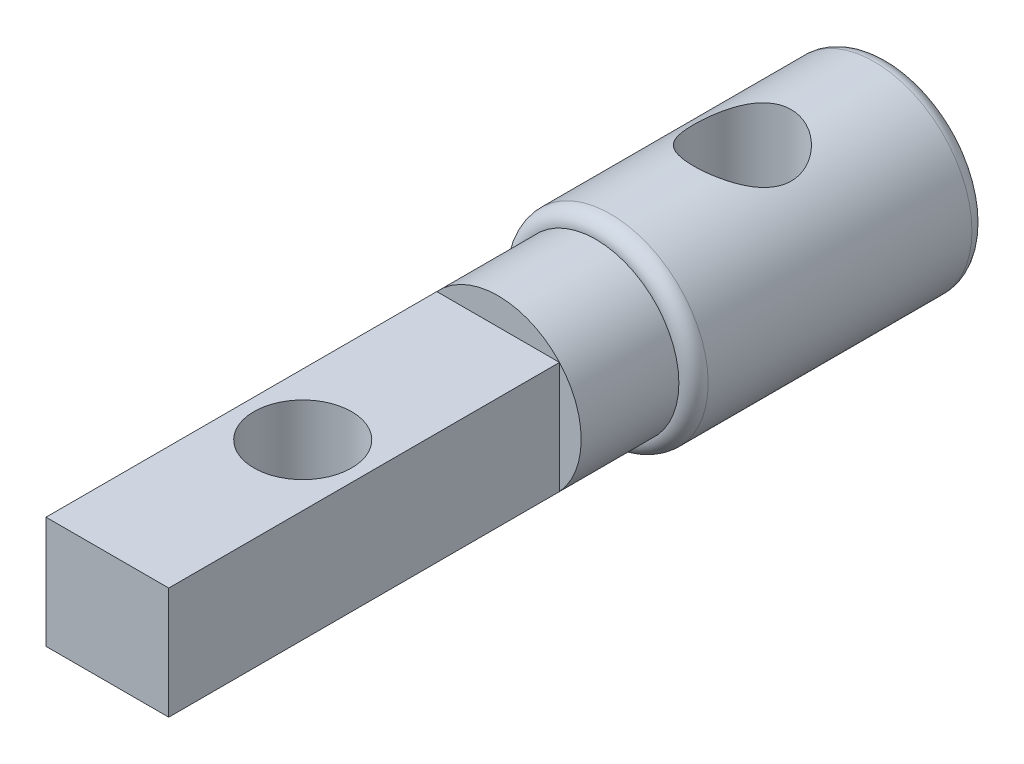
ISO-10303-21;
HEADER;
FILE_DESCRIPTION(('STEP AP214'),'2;1');
FILE_NAME('part.step','',(''),(''),'','','');
FILE_SCHEMA(('AUTOMOTIVE_DESIGN { 1 0 10303 214 1 1 1 1 }'));
ENDSEC;
DATA;
#1=APPLICATION_CONTEXT('core data for automotive mechanical design processes');
#2=APPLICATION_PROTOCOL_DEFINITION('international standard','automotive_design',2000,#1);
#3=PRODUCT_CONTEXT('',#1,'mechanical');
#4=PRODUCT('Part','Part','',(#3));
#5=PRODUCT_RELATED_PRODUCT_CATEGORY('part','',(#4));
#6=PRODUCT_DEFINITION_FORMATION('','',#4);
#7=PRODUCT_DEFINITION_CONTEXT('part definition',#1,'design');
#8=PRODUCT_DEFINITION('design','',#6,#7);
#9=PRODUCT_DEFINITION_SHAPE('','',#8);
#10=(LENGTH_UNIT() NAMED_UNIT(*) SI_UNIT(.MILLI.,.METRE.));
#11=(NAMED_UNIT(*) PLANE_ANGLE_UNIT() SI_UNIT($,.RADIAN.));
#12=(NAMED_UNIT(*) SI_UNIT($,.STERADIAN.) SOLID_ANGLE_UNIT());
#13=UNCERTAINTY_MEASURE_WITH_UNIT(LENGTH_MEASURE(1.E-05),#10,'distance_accuracy_value','');
#14=(GEOMETRIC_REPRESENTATION_CONTEXT(3) GLOBAL_UNCERTAINTY_ASSIGNED_CONTEXT((#13)) GLOBAL_UNIT_ASSIGNED_CONTEXT((#10,
#11,#12)) REPRESENTATION_CONTEXT('',''));
#15=CARTESIAN_POINT('',(0.,0.,0.));
#16=DIRECTION('',(0.,0.,1.));
#17=DIRECTION('',(1.,0.,0.));
#18=AXIS2_PLACEMENT_3D('',#15,#16,#17);
#19=CARTESIAN_POINT('',(0.,0.,160.));
#20=DIRECTION('',(0.,0.,-1.));
#21=DIRECTION('',(-1.,0.,0.));
#22=AXIS2_PLACEMENT_3D('',#19,#20,#21);
#23=CYLINDRICAL_SURFACE('',#22,17.);
#24=CARTESIAN_POINT('',(0.,0.,60.));
#25=DIRECTION('',(0.,0.,1.));
#26=DIRECTION('',(1.,0.,0.));
#27=AXIS2_PLACEMENT_3D('',#24,#25,#26);
#28=CIRCLE('',#27,17.);
#29=CARTESIAN_POINT('',(17.,0.,60.));
#30=VERTEX_POINT('',#29);
#31=EDGE_CURVE('E11',#30,#30,#28,.T.);
#32=ORIENTED_EDGE('',*,*,#31,.T.);
#33=EDGE_LOOP('',(#32));
#34=FACE_BOUND('',#33,.T.);
#35=CARTESIAN_POINT('',(0.,0.,80.));
#36=DIRECTION('',(0.,0.,1.));
#37=DIRECTION('',(1.,0.,0.));
#38=AXIS2_PLACEMENT_3D('',#35,#36,#37);
#39=CIRCLE('',#38,17.);
#40=CARTESIAN_POINT('',(12.562655430302,-11.4533701825927,80.));
#41=VERTEX_POINT('',#40);
#42=CARTESIAN_POINT('',(12.562655430302,11.4533701825927,80.));
#43=VERTEX_POINT('',#42);
#44=EDGE_CURVE('E92',#41,#43,#39,.T.);
#45=ORIENTED_EDGE('',*,*,#44,.F.);
#46=CARTESIAN_POINT('',(0.,0.,80.));
#47=DIRECTION('',(0.,0.,1.));
#48=DIRECTION('',(1.,0.,0.));
#49=AXIS2_PLACEMENT_3D('',#46,#47,#48);
#50=CIRCLE('',#49,17.);
#51=CARTESIAN_POINT('',(-12.562655430302,-11.4533701825927,80.));
#52=VERTEX_POINT('',#51);
#53=EDGE_CURVE('E87',#52,#41,#50,.T.);
#54=ORIENTED_EDGE('',*,*,#53,.F.);
#55=CARTESIAN_POINT('',(0.,0.,80.));
#56=DIRECTION('',(0.,0.,1.));
#57=DIRECTION('',(1.,0.,0.));
#58=AXIS2_PLACEMENT_3D('',#55,#56,#57);
#59=CIRCLE('',#58,17.);
#60=CARTESIAN_POINT('',(-12.562655430302,11.4533701825927,80.));
#61=VERTEX_POINT('',#60);
#62=EDGE_CURVE('E191',#61,#52,#59,.T.);
#63=ORIENTED_EDGE('',*,*,#62,.F.);
#64=CARTESIAN_POINT('',(0.,0.,80.));
#65=DIRECTION('',(0.,0.,1.));
#66=DIRECTION('',(1.,0.,0.));
#67=AXIS2_PLACEMENT_3D('',#64,#65,#66);
#68=CIRCLE('',#67,17.);
#69=EDGE_CURVE('E101',#43,#61,#68,.T.);
#70=ORIENTED_EDGE('',*,*,#69,.F.);
#71=EDGE_LOOP('',(#45,#54,#63,#70));
#72=FACE_BOUND('',#71,.T.);
#73=ADVANCED_FACE('F37',(#34,#72),#23,.T.);
#74=CARTESIAN_POINT('',(0.,0.,160.));
#75=DIRECTION('',(0.,0.,1.));
#76=DIRECTION('',(1.,0.,0.));
#77=AXIS2_PLACEMENT_3D('',#74,#75,#76);
#78=PLANE('',#77);
#79=DIRECTION('',(0.,-1.,0.));
#80=VECTOR('',#79,1.);
#81=CARTESIAN_POINT('',(12.562655430302,0.,160.));
#82=LINE('',#81,#80);
#83=CARTESIAN_POINT('',(12.562655430302,11.4533701825927,160.));
#84=VERTEX_POINT('',#83);
#85=CARTESIAN_POINT('',(12.562655430302,-11.4533701825927,160.));
#86=VERTEX_POINT('',#85);
#87=EDGE_CURVE('E81',#84,#86,#82,.T.);
#88=ORIENTED_EDGE('',*,*,#87,.F.);
#89=DIRECTION('',(1.,0.,0.));
#90=VECTOR('',#89,1.);
#91=CARTESIAN_POINT('',(0.,11.4533701825927,160.));
#92=LINE('',#91,#90);
#93=CARTESIAN_POINT('',(-12.562655430302,11.4533701825927,160.));
#94=VERTEX_POINT('',#93);
#95=EDGE_CURVE('E86',#94,#84,#92,.T.);
#96=ORIENTED_EDGE('',*,*,#95,.F.);
#97=DIRECTION('',(0.,-1.,0.));
#98=VECTOR('',#97,1.);
#99=CARTESIAN_POINT('',(-12.562655430302,0.,160.));
#100=LINE('',#99,#98);
#101=CARTESIAN_POINT('',(-12.562655430302,-11.4533701825927,160.));
#102=VERTEX_POINT('',#101);
#103=EDGE_CURVE('E54',#94,#102,#100,.T.);
#104=ORIENTED_EDGE('',*,*,#103,.T.);
#105=DIRECTION('',(1.,0.,0.));
#106=VECTOR('',#105,1.);
#107=CARTESIAN_POINT('',(0.,-11.4533701825927,160.));
#108=LINE('',#107,#106);
#109=EDGE_CURVE('E109',#102,#86,#108,.T.);
#110=ORIENTED_EDGE('',*,*,#109,.T.);
#111=EDGE_LOOP('',(#88,#96,#104,#110));
#112=FACE_BOUND('',#111,.T.);
#113=ADVANCED_FACE('F146',(#112),#78,.T.);
#114=CARTESIAN_POINT('',(0.,0.,60.));
#115=DIRECTION('',(0.,0.,-1.));
#116=DIRECTION('',(-1.,0.,0.));
#117=AXIS2_PLACEMENT_3D('',#114,#115,#116);
#118=CYLINDRICAL_SURFACE('',#117,20.);
#119=CARTESIAN_POINT('',(0.,0.,3.));
#120=DIRECTION('',(0.,0.,1.));
#121=DIRECTION('',(1.,0.,0.));
#122=AXIS2_PLACEMENT_3D('',#119,#120,#121);
#123=CIRCLE('',#122,20.);
#124=CARTESIAN_POINT('',(20.,0.,3.));
#125=VERTEX_POINT('',#124);
#126=EDGE_CURVE('E170',#125,#125,#123,.T.);
#127=ORIENTED_EDGE('',*,*,#126,.T.);
#128=EDGE_LOOP('',(#127));
#129=FACE_BOUND('',#128,.T.);
#130=CARTESIAN_POINT('',(0.,0.,57.));
#131=DIRECTION('',(0.,0.,1.));
#132=DIRECTION('',(1.,0.,0.));
#133=AXIS2_PLACEMENT_3D('',#130,#131,#132);
#134=CIRCLE('',#133,20.);
#135=CARTESIAN_POINT('',(20.,0.,57.));
#136=VERTEX_POINT('',#135);
#137=EDGE_CURVE('E168',#136,#136,#134,.F.);
#138=ORIENTED_EDGE('',*,*,#137,.T.);
#139=EDGE_LOOP('',(#138));
#140=FACE_BOUND('',#139,.T.);
#141=CARTESIAN_POINT('',(0.,-20.,40.));
#142=CARTESIAN_POINT('',(0.26297774757047,-19.9999992010162,39.9999991311544));
#143=CARTESIAN_POINT('',(0.525973881907791,-19.9948010837,39.9896144860554));
#144=CARTESIAN_POINT('',(1.05002923117121,-19.9741395354228,39.9481941751404));
#145=CARTESIAN_POINT('',(1.31108755349614,-19.9586716387275,39.9171495254669));
#146=CARTESIAN_POINT('',(1.82963226043827,-19.9178362229901,39.8347080895986));
#147=CARTESIAN_POINT('',(2.08711188872546,-19.8924520749392,39.7832771145179));
#148=CARTESIAN_POINT('',(2.59618182802919,-19.8324363448083,39.6606617858704));
#149=CARTESIAN_POINT('',(2.847772725312,-19.7978056875818,39.5894794078488));
#150=CARTESIAN_POINT('',(3.34246836822569,-19.720303023444,39.4284309978279));
#151=CARTESIAN_POINT('',(3.58560245696295,-19.6774637808779,39.3386391325444));
#152=CARTESIAN_POINT('',(4.06298432085465,-19.5844658749963,39.1410556783159));
#153=CARTESIAN_POINT('',(4.29723190454894,-19.5343070540929,39.0332637018277));
#154=CARTESIAN_POINT('',(4.75551398861712,-19.4278257394007,38.8006307634747));
#155=CARTESIAN_POINT('',(4.97955221985718,-19.3715055232139,38.6757960973552));
#156=CARTESIAN_POINT('',(5.41653080360957,-19.2538936046229,38.4099130709816));
#157=CARTESIAN_POINT('',(5.62946673237805,-19.1925999450287,38.2688583184689));
#158=CARTESIAN_POINT('',(6.05571153636931,-19.0625536763854,37.9624954366143));
#159=CARTESIAN_POINT('',(6.2682689260733,-18.9935741626949,37.7962377965806));
#160=CARTESIAN_POINT('',(6.67880739057353,-18.8531326273725,37.4475548696851));
#161=CARTESIAN_POINT('',(6.8767876309065,-18.7816704639663,37.265128658575));
#162=CARTESIAN_POINT('',(7.25738906236846,-18.6379106306311,36.8849614203297));
#163=CARTESIAN_POINT('',(7.44000060064986,-18.5656124675679,36.687210915794));
#164=CARTESIAN_POINT('',(7.7888836174931,-18.4219676840917,36.2773980437752));
#165=CARTESIAN_POINT('',(7.95515202519227,-18.3506212446753,36.0653329991786));
#166=CARTESIAN_POINT('',(8.28271110573769,-18.2052535437119,35.6108068013796));
#167=CARTESIAN_POINT('',(8.44260565220417,-18.1314567024133,35.3672646356158));
#168=CARTESIAN_POINT('',(8.74109142208519,-17.9894590508883,34.8660415201669));
#169=CARTESIAN_POINT('',(8.87969167215242,-17.9212558752544,34.6083666245536));
#170=CARTESIAN_POINT('',(9.13438777848808,-17.7927881626278,34.0803007968687));
#171=CARTESIAN_POINT('',(9.25049044721743,-17.7325212242509,33.8099137450612));
#172=CARTESIAN_POINT('',(9.45894522420918,-17.6222099564148,33.25811404655));
#173=CARTESIAN_POINT('',(9.55129996419766,-17.5721644943465,32.9767026255442));
#174=CARTESIAN_POINT('',(9.70625458779874,-17.4870229092242,32.4220849599405));
#175=CARTESIAN_POINT('',(9.77030307761469,-17.4512120054423,32.14939374522));
#176=CARTESIAN_POINT('',(9.87543221046261,-17.3919377517219,31.5982835344642));
#177=CARTESIAN_POINT('',(9.91651383598184,-17.368473873599,31.3198647839724));
#178=CARTESIAN_POINT('',(9.97504777353869,-17.3349233192211,30.7599854008135));
#179=CARTESIAN_POINT('',(9.99252007209236,-17.3248253281998,30.478527544653));
#180=CARTESIAN_POINT('',(10.0036080043825,-17.3184259915651,29.914997490163));
#181=CARTESIAN_POINT('',(9.99722591425208,-17.3221233296318,29.6329253530135));
#182=CARTESIAN_POINT('',(9.96291632672931,-17.3418743842694,29.1045952020966));
#183=CARTESIAN_POINT('',(9.93766509151722,-17.3563927185974,28.8580998286423));
#184=CARTESIAN_POINT('',(9.8690882825972,-17.3954780340008,28.3683607757045));
#185=CARTESIAN_POINT('',(9.82575672853391,-17.4200483398744,28.1251181996355));
#186=CARTESIAN_POINT('',(9.72152759312325,-17.4784283554102,27.6436082749706));
#187=CARTESIAN_POINT('',(9.66063238238804,-17.5122368181421,27.4053402595966));
#188=CARTESIAN_POINT('',(9.52187989459161,-17.5880654989193,26.9350464357646));
#189=CARTESIAN_POINT('',(9.44401584795466,-17.6300889935922,26.7030231602177));
#190=CARTESIAN_POINT('',(9.27007793534026,-17.7221768246774,26.2412894084719));
#191=CARTESIAN_POINT('',(9.17362860412847,-17.7724029635355,26.0117529467327));
#192=CARTESIAN_POINT('',(8.96447979140212,-17.878810533816,25.5615618305034));
#193=CARTESIAN_POINT('',(8.85177491107832,-17.9349939421242,25.3409101581057));
#194=CARTESIAN_POINT('',(8.61087933619458,-18.0518884826287,24.909438225384));
#195=CARTESIAN_POINT('',(8.4826858636817,-18.1126004262899,24.6986197381147));
#196=CARTESIAN_POINT('',(8.21155546672611,-18.2371218065418,24.2876476337912));
#197=CARTESIAN_POINT('',(8.06861764351119,-18.3009314318325,24.0874946680049));
#198=CARTESIAN_POINT('',(7.74962298190964,-18.4384710076206,23.6738683200168));
#199=CARTESIAN_POINT('',(7.57166567582239,-18.5124312542501,23.461933896661));
#200=CARTESIAN_POINT('',(7.19890817206694,-18.6605447929763,23.0536251358376));
#201=CARTESIAN_POINT('',(7.00411219662654,-18.7346980321841,22.8572469212453));
#202=CARTESIAN_POINT('',(6.5984132459434,-18.8814062531242,22.4808534192401));
#203=CARTESIAN_POINT('',(6.38749704374536,-18.9539598580541,22.3008518402428));
#204=CARTESIAN_POINT('',(5.9507961704325,-19.0955673475654,21.9585471364973));
#205=CARTESIAN_POINT('',(5.72501741077281,-19.164622604476,21.7962370425202));
#206=CARTESIAN_POINT('',(5.24872768197162,-19.3006480329725,21.4832041345111));
#207=CARTESIAN_POINT('',(4.99755374827171,-19.3673693587667,21.3333791540281));
#208=CARTESIAN_POINT('',(4.48152997851449,-19.4932401539485,21.0556307630696));
#209=CARTESIAN_POINT('',(4.21667950634011,-19.5523892706948,20.927708372514));
#210=CARTESIAN_POINT('',(3.67526022803788,-19.6613492326778,20.6952056965372));
#211=CARTESIAN_POINT('',(3.39869900661396,-19.7111660121174,20.5906105697672));
#212=CARTESIAN_POINT('',(2.83582264507487,-19.7999810198758,20.4059492211278));
#213=CARTESIAN_POINT('',(2.54950863124168,-19.8389804926862,20.3258801775116));
#214=CARTESIAN_POINT('',(1.99360082076711,-19.9021913169255,20.1969341388409));
#215=CARTESIAN_POINT('',(1.72458658463508,-19.9273600412885,20.1460227570388));
#216=CARTESIAN_POINT('',(1.18250594424724,-19.9668602547768,20.0663848419067));
#217=CARTESIAN_POINT('',(0.909439761223922,-19.9811923333691,20.03765710188));
#218=CARTESIAN_POINT('',(0.361621452061381,-19.9986076087937,20.0027736792174));
#219=CARTESIAN_POINT('',(0.0868700440476486,-20.0016953032259,19.9966089716722));
#220=CARTESIAN_POINT('',(-0.462095284936296,-19.996544733302,20.0069111876297));
#221=CARTESIAN_POINT('',(-0.736309229155635,-19.9883069701864,20.0233771095491));
#222=CARTESIAN_POINT('',(-1.26069578442055,-19.9618171280824,20.0765620616977));
#223=CARTESIAN_POINT('',(-1.51108216427541,-19.9443921243345,20.1116095728205));
#224=CARTESIAN_POINT('',(-2.00770334634759,-19.9005341339856,20.2003699951793));
#225=CARTESIAN_POINT('',(-2.25393841461836,-19.8741017269811,20.2540817054405));
#226=CARTESIAN_POINT('',(-2.7406844611906,-19.812845023159,20.3796139920955));
#227=CARTESIAN_POINT('',(-2.98119512032807,-19.7780202596251,20.4514355756276));
#228=CARTESIAN_POINT('',(-3.45505082107349,-19.7007681992834,20.6124946583728));
#229=CARTESIAN_POINT('',(-3.68839556112771,-19.6583405830473,20.7017328893482));
#230=CARTESIAN_POINT('',(-4.15316088617015,-19.5655046555384,20.8996247243195));
#231=CARTESIAN_POINT('',(-4.38433936906094,-19.5149041886911,21.008757038834));
#232=CARTESIAN_POINT('',(-4.83663774643759,-19.4077573479828,21.2437478963626));
#233=CARTESIAN_POINT('',(-5.05775400766403,-19.3512088504371,21.3696124177045));
#234=CARTESIAN_POINT('',(-5.70436813169987,-19.1744474473865,21.7709434864471));
#235=CARTESIAN_POINT('',(-6.11337858448959,-19.0470672570173,22.070253667661));
#236=CARTESIAN_POINT('',(-6.91779518371265,-18.7707873202954,22.7577005416899));
#237=CARTESIAN_POINT('',(-7.30792110762594,-18.6210027147805,23.1516737079916));
#238=CARTESIAN_POINT('',(-7.84082560671492,-18.3999640224111,23.7872605585902));
#239=CARTESIAN_POINT('',(-8.00984942409511,-18.3268393772916,24.0067352134642));
#240=CARTESIAN_POINT('',(-8.32960568094727,-18.183737266458,24.4597394427642));
#241=CARTESIAN_POINT('',(-8.4803354830786,-18.1137602554328,24.6932710364541));
#242=CARTESIAN_POINT('',(-8.76928163027866,-17.9757225676596,25.1849259938433));
#243=CARTESIAN_POINT('',(-8.90652817819507,-17.9079221139821,25.4436933067517));
#244=CARTESIAN_POINT('',(-9.15837639012035,-17.7804404562871,25.9738115445517));
#245=CARTESIAN_POINT('',(-9.27298894306127,-17.7207553524022,26.2451563406136));
#246=CARTESIAN_POINT('',(-9.47827705930681,-17.6118078617936,26.7985498632991));
#247=CARTESIAN_POINT('',(-9.56897185129601,-17.5625371088176,27.0805897816227));
#248=CARTESIAN_POINT('',(-9.72530086409336,-17.4764560330943,27.6533832153516));
#249=CARTESIAN_POINT('',(-9.79093896514153,-17.4396437811433,27.9441353740658));
#250=CARTESIAN_POINT('',(-9.89107565144743,-17.3830260812378,28.5035247967187));
#251=CARTESIAN_POINT('',(-9.92795857968716,-17.3619273114046,28.7716057546725));
#252=CARTESIAN_POINT('',(-9.97987692141645,-17.332136815937,29.3105606593007));
#253=CARTESIAN_POINT('',(-9.99491382071395,-17.3234442465236,29.5814344147671));
#254=CARTESIAN_POINT('',(-10.0029096686844,-17.3188284226879,30.1235135688981));
#255=CARTESIAN_POINT('',(-9.9958767833924,-17.3229004452416,30.39471880779));
#256=CARTESIAN_POINT('',(-9.95985898725887,-17.3436339919872,30.9351721097638));
#257=CARTESIAN_POINT('',(-9.93087497508662,-17.3602950007916,31.2044202525128));
#258=CARTESIAN_POINT('',(-9.85519722920277,-17.4033551463061,31.7131144453933));
#259=CARTESIAN_POINT('',(-9.81046230963216,-17.4286705637748,31.952948008925));
#260=CARTESIAN_POINT('',(-9.70388285528389,-17.4882355534742,32.4277291978268));
#261=CARTESIAN_POINT('',(-9.64203265928581,-17.5224880816187,32.6626751788365));
#262=CARTESIAN_POINT('',(-9.50186064219782,-17.5988921487312,33.126223616403));
#263=CARTESIAN_POINT('',(-9.42354151869526,-17.6410423939411,33.3548271049183));
#264=CARTESIAN_POINT('',(-9.25107208633864,-17.7320944008379,33.8046984883442));
#265=CARTESIAN_POINT('',(-9.15691467555994,-17.7809991895098,34.0259630389356));
#266=CARTESIAN_POINT('',(-8.94668289722952,-17.8877520145129,34.4746258921229));
#267=CARTESIAN_POINT('',(-8.82956366921283,-17.9459794825375,34.7014441786001));
#268=CARTESIAN_POINT('',(-8.57895403368727,-18.067122458149,35.144545430872));
#269=CARTESIAN_POINT('',(-8.44546216273867,-18.130038384608,35.3608274524837));
#270=CARTESIAN_POINT('',(-8.16285657798003,-18.2590224525038,35.7820513773595));
#271=CARTESIAN_POINT('',(-8.0137373905154,-18.3250916939848,35.9869892685381));
#272=CARTESIAN_POINT('',(-7.70065351710477,-18.4588439084551,36.3846685995703));
#273=CARTESIAN_POINT('',(-7.53668670721057,-18.5265271112979,36.5774082877534));
#274=CARTESIAN_POINT('',(-7.17380336462424,-18.6702735648096,36.9725890708702));
#275=CARTESIAN_POINT('',(-6.97306234663123,-18.746353564782,37.1733531745623));
#276=CARTESIAN_POINT('',(-6.55492133587247,-18.8966226391637,37.557351407736));
#277=CARTESIAN_POINT('',(-6.33752607360945,-18.9708122426046,37.7405904820546));
#278=CARTESIAN_POINT('',(-5.88693376044406,-19.1154396310611,38.0885782201041));
#279=CARTESIAN_POINT('',(-5.65372458790795,-19.1858744624017,38.2533124366426));
#280=CARTESIAN_POINT('',(-5.1728954421103,-19.3210638569054,38.5628791276405));
#281=CARTESIAN_POINT('',(-4.92527630037179,-19.3858187472881,38.70771274884));
#282=CARTESIAN_POINT('',(-4.41518835199793,-19.5083417849818,38.9771882779967));
#283=CARTESIAN_POINT('',(-4.15262447046932,-19.5660555714726,39.101675330338));
#284=CARTESIAN_POINT('',(-3.61607511779452,-19.6722841833782,39.3278473632244));
#285=CARTESIAN_POINT('',(-3.34209105214395,-19.7208001367275,39.4295351399349));
#286=CARTESIAN_POINT('',(-2.78539452130531,-19.8070877528212,39.6086874933069));
#287=CARTESIAN_POINT('',(-2.50270444198693,-19.8448847753657,39.6862092878952));
#288=CARTESIAN_POINT('',(-1.93047321727417,-19.908692874149,39.8162760900684));
#289=CARTESIAN_POINT('',(-1.64093637072212,-19.9347111494098,39.8688363547921));
#290=CARTESIAN_POINT('',(-1.12608352412093,-19.9695276660452,39.9389489035084));
#291=CARTESIAN_POINT('',(-0.901651680276708,-19.9809348086311,39.961823466314));
#292=CARTESIAN_POINT('',(-0.451484431282409,-19.9961714231232,39.9923495975715));
#293=CARTESIAN_POINT('',(-0.225748990324602,-20.0000006858747,40.0000007458465));
#294=CARTESIAN_POINT('',(0.,-20.,40.));
#295=B_SPLINE_CURVE_WITH_KNOTS('',3,(#141,#142,#143,#144,#145,#146,#147,#148,#149,#150,#151,
#152,#153,#154,#155,#156,#157,#158,#159,#160,#161,#162,#163,#164,#165,#166,#167,#168,#169,#170,
#171,#172,#173,#174,#175,#176,#177,#178,#179,#180,#181,#182,#183,#184,#185,#186,#187,#188,#189,
#190,#191,#192,#193,#194,#195,#196,#197,#198,#199,#200,#201,#202,#203,#204,#205,#206,#207,#208,
#209,#210,#211,#212,#213,#214,#215,#216,#217,#218,#219,#220,#221,#222,#223,#224,#225,#226,#227,
#228,#229,#230,#231,#232,#233,#234,#235,#236,#237,#238,#239,#240,#241,#242,#243,#244,#245,#246,
#247,#248,#249,#250,#251,#252,#253,#254,#255,#256,#257,#258,#259,#260,#261,#262,#263,#264,#265,
#266,#267,#268,#269,#270,#271,#272,#273,#274,#275,#276,#277,#278,#279,#280,#281,#282,#283,#284,
#285,#286,#287,#288,#289,#290,#291,#292,#293,#294),.UNSPECIFIED.,.T.,.F.,(4,2,2,2,2,2,2,2,2,2,2,
2,2,2,2,2,2,2,2,2,2,2,2,2,2,2,2,2,2,2,2,2,2,2,2,2,2,2,2,2,2,2,2,2,2,2,2,2,2,2,2,2,2,2,2,2,2,2,2,
2,2,2,2,2,2,2,2,2,2,2,2,2,2,2,2,2,4),(0.,0.788710589251,1.57776436803952,2.36814706638947,
3.15845073874465,3.94566328103175,4.73289277422682,5.51983223968627,6.30708290401819,
7.14179607204602,7.97655698581611,8.81183834708134,9.64727635829488,10.5477781072243,
11.447897073936,12.3477430494904,13.2474892618302,14.0934532489038,14.9393810441651,
15.7845922682139,16.6297228461313,17.3734776288846,18.1174786157194,18.8613792297722,
19.6055771618311,20.3667813084855,21.1282388516736,21.889833169209,22.6514739387577,
23.509891476961,24.3680943913845,25.2270091977564,26.0855844184834,26.9843425878092,
27.8831425974923,28.781369127958,29.6794922778509,30.5032194900487,31.3269018918016,
32.1502547956571,32.9735712608452,33.7329722323226,34.4923243480979,35.2517187027837,
36.0111449703724,36.7921013676949,37.5733375502822,39.1349970223263,40.850013011907,
41.7087612506847,42.5676331434658,43.4684238669888,44.3687801699595,45.2684104094407,
46.1679012770191,46.9810473193187,47.7941380547513,48.606927974181,49.4196846201562,
50.1547113408423,50.889981477547,51.6251312717133,52.3606115917998,53.1452977478639,
53.9300540928963,54.7150862327853,55.5002308492403,56.3809909668478,57.2615018327172,
58.1426954259119,59.0238382204153,59.9114030040692,60.7988588747469,61.6841972652664,
62.5689938151569,63.2460309664337,63.9230868041488),.UNSPECIFIED.);
#296=CARTESIAN_POINT('',(0.,-20.,40.));
#297=VERTEX_POINT('',#296);
#298=EDGE_CURVE('E124',#297,#297,#295,.T.);
#299=ORIENTED_EDGE('',*,*,#298,.T.);
#300=EDGE_LOOP('',(#299));
#301=FACE_BOUND('',#300,.T.);
#302=CARTESIAN_POINT('',(0.,20.,40.));
#303=CARTESIAN_POINT('',(-0.26297774757047,19.9999992010162,39.9999991311544));
#304=CARTESIAN_POINT('',(-0.525973881907791,19.9948010837,39.9896144860554));
#305=CARTESIAN_POINT('',(-1.05002923117121,19.9741395354228,39.9481941751404));
#306=CARTESIAN_POINT('',(-1.31108755349614,19.9586716387275,39.9171495254669));
#307=CARTESIAN_POINT('',(-1.82963226043827,19.9178362229901,39.8347080895986));
#308=CARTESIAN_POINT('',(-2.08711188872546,19.8924520749392,39.7832771145179));
#309=CARTESIAN_POINT('',(-2.59618182802919,19.8324363448083,39.6606617858704));
#310=CARTESIAN_POINT('',(-2.847772725312,19.7978056875818,39.5894794078488));
#311=CARTESIAN_POINT('',(-3.34246836822569,19.720303023444,39.4284309978279));
#312=CARTESIAN_POINT('',(-3.58560245696295,19.6774637808779,39.3386391325444));
#313=CARTESIAN_POINT('',(-4.06298432085465,19.5844658749963,39.1410556783159));
#314=CARTESIAN_POINT('',(-4.29723190454894,19.5343070540929,39.0332637018277));
#315=CARTESIAN_POINT('',(-4.75551398861712,19.4278257394007,38.8006307634747));
#316=CARTESIAN_POINT('',(-4.97955221985718,19.3715055232139,38.6757960973552));
#317=CARTESIAN_POINT('',(-5.41653080360957,19.2538936046229,38.4099130709816));
#318=CARTESIAN_POINT('',(-5.62946673237805,19.1925999450287,38.2688583184689));
#319=CARTESIAN_POINT('',(-6.05571153636931,19.0625536763854,37.9624954366143));
#320=CARTESIAN_POINT('',(-6.2682689260733,18.9935741626949,37.7962377965806));
#321=CARTESIAN_POINT('',(-6.67880739057353,18.8531326273725,37.4475548696851));
#322=CARTESIAN_POINT('',(-6.8767876309065,18.7816704639663,37.265128658575));
#323=CARTESIAN_POINT('',(-7.25738906236846,18.6379106306311,36.8849614203297));
#324=CARTESIAN_POINT('',(-7.44000060064986,18.5656124675679,36.687210915794));
#325=CARTESIAN_POINT('',(-7.7888836174931,18.4219676840917,36.2773980437752));
#326=CARTESIAN_POINT('',(-7.95515202519227,18.3506212446753,36.0653329991786));
#327=CARTESIAN_POINT('',(-8.28271110573769,18.2052535437119,35.6108068013796));
#328=CARTESIAN_POINT('',(-8.44260565220417,18.1314567024133,35.3672646356158));
#329=CARTESIAN_POINT('',(-8.74109142208519,17.9894590508883,34.8660415201669));
#330=CARTESIAN_POINT('',(-8.87969167215242,17.9212558752544,34.6083666245536));
#331=CARTESIAN_POINT('',(-9.13438777848808,17.7927881626278,34.0803007968687));
#332=CARTESIAN_POINT('',(-9.25049044721743,17.7325212242509,33.8099137450612));
#333=CARTESIAN_POINT('',(-9.45894522420918,17.6222099564148,33.25811404655));
#334=CARTESIAN_POINT('',(-9.55129996419766,17.5721644943465,32.9767026255442));
#335=CARTESIAN_POINT('',(-9.70625458779874,17.4870229092242,32.4220849599405));
#336=CARTESIAN_POINT('',(-9.77030307761469,17.4512120054423,32.14939374522));
#337=CARTESIAN_POINT('',(-9.87543221046261,17.3919377517219,31.5982835344642));
#338=CARTESIAN_POINT('',(-9.91651383598184,17.368473873599,31.3198647839724));
#339=CARTESIAN_POINT('',(-9.97504777353869,17.3349233192211,30.7599854008135));
#340=CARTESIAN_POINT('',(-9.99252007209236,17.3248253281998,30.478527544653));
#341=CARTESIAN_POINT('',(-10.0036080043825,17.3184259915651,29.914997490163));
#342=CARTESIAN_POINT('',(-9.99722591425208,17.3221233296318,29.6329253530135));
#343=CARTESIAN_POINT('',(-9.96291632672931,17.3418743842694,29.1045952020966));
#344=CARTESIAN_POINT('',(-9.93766509151722,17.3563927185974,28.8580998286423));
#345=CARTESIAN_POINT('',(-9.8690882825972,17.3954780340008,28.3683607757045));
#346=CARTESIAN_POINT('',(-9.82575672853391,17.4200483398744,28.1251181996355));
#347=CARTESIAN_POINT('',(-9.72152759312325,17.4784283554102,27.6436082749706));
#348=CARTESIAN_POINT('',(-9.66063238238804,17.5122368181421,27.4053402595966));
#349=CARTESIAN_POINT('',(-9.52187989459161,17.5880654989193,26.9350464357646));
#350=CARTESIAN_POINT('',(-9.44401584795466,17.6300889935922,26.7030231602177));
#351=CARTESIAN_POINT('',(-9.27007793534026,17.7221768246774,26.2412894084719));
#352=CARTESIAN_POINT('',(-9.17362860412847,17.7724029635355,26.0117529467327));
#353=CARTESIAN_POINT('',(-8.96447979140212,17.878810533816,25.5615618305034));
#354=CARTESIAN_POINT('',(-8.85177491107832,17.9349939421242,25.3409101581057));
#355=CARTESIAN_POINT('',(-8.61087933619458,18.0518884826287,24.909438225384));
#356=CARTESIAN_POINT('',(-8.4826858636817,18.1126004262899,24.6986197381147));
#357=CARTESIAN_POINT('',(-8.21155546672611,18.2371218065418,24.2876476337912));
#358=CARTESIAN_POINT('',(-8.06861764351119,18.3009314318325,24.0874946680049));
#359=CARTESIAN_POINT('',(-7.74962298190964,18.4384710076206,23.6738683200168));
#360=CARTESIAN_POINT('',(-7.57166567582239,18.5124312542501,23.461933896661));
#361=CARTESIAN_POINT('',(-7.19890817206694,18.6605447929763,23.0536251358376));
#362=CARTESIAN_POINT('',(-7.00411219662654,18.7346980321841,22.8572469212453));
#363=CARTESIAN_POINT('',(-6.5984132459434,18.8814062531242,22.4808534192401));
#364=CARTESIAN_POINT('',(-6.38749704374536,18.9539598580541,22.3008518402428));
#365=CARTESIAN_POINT('',(-5.9507961704325,19.0955673475654,21.9585471364973));
#366=CARTESIAN_POINT('',(-5.72501741077281,19.164622604476,21.7962370425202));
#367=CARTESIAN_POINT('',(-5.24872768197162,19.3006480329725,21.4832041345111));
#368=CARTESIAN_POINT('',(-4.99755374827171,19.3673693587667,21.3333791540281));
#369=CARTESIAN_POINT('',(-4.48152997851449,19.4932401539485,21.0556307630696));
#370=CARTESIAN_POINT('',(-4.21667950634011,19.5523892706948,20.927708372514));
#371=CARTESIAN_POINT('',(-3.67526022803788,19.6613492326778,20.6952056965372));
#372=CARTESIAN_POINT('',(-3.39869900661396,19.7111660121174,20.5906105697672));
#373=CARTESIAN_POINT('',(-2.83582264507487,19.7999810198758,20.4059492211278));
#374=CARTESIAN_POINT('',(-2.54950863124168,19.8389804926862,20.3258801775116));
#375=CARTESIAN_POINT('',(-1.99360082076711,19.9021913169255,20.1969341388409));
#376=CARTESIAN_POINT('',(-1.72458658463508,19.9273600412885,20.1460227570388));
#377=CARTESIAN_POINT('',(-1.18250594424724,19.9668602547768,20.0663848419067));
#378=CARTESIAN_POINT('',(-0.909439761223922,19.9811923333691,20.03765710188));
#379=CARTESIAN_POINT('',(-0.361621452061381,19.9986076087937,20.0027736792174));
#380=CARTESIAN_POINT('',(-0.0868700440476486,20.0016953032259,19.9966089716722));
#381=CARTESIAN_POINT('',(0.462095284936296,19.996544733302,20.0069111876297));
#382=CARTESIAN_POINT('',(0.736309229155635,19.9883069701864,20.0233771095491));
#383=CARTESIAN_POINT('',(1.26069578442055,19.9618171280824,20.0765620616977));
#384=CARTESIAN_POINT('',(1.51108216427541,19.9443921243345,20.1116095728205));
#385=CARTESIAN_POINT('',(2.00770334634759,19.9005341339856,20.2003699951793));
#386=CARTESIAN_POINT('',(2.25393841461836,19.8741017269811,20.2540817054405));
#387=CARTESIAN_POINT('',(2.7406844611906,19.812845023159,20.3796139920955));
#388=CARTESIAN_POINT('',(2.98119512032807,19.7780202596251,20.4514355756276));
#389=CARTESIAN_POINT('',(3.45505082107349,19.7007681992834,20.6124946583728));
#390=CARTESIAN_POINT('',(3.68839556112771,19.6583405830473,20.7017328893482));
#391=CARTESIAN_POINT('',(4.15316088617015,19.5655046555384,20.8996247243195));
#392=CARTESIAN_POINT('',(4.38433936906094,19.5149041886911,21.008757038834));
#393=CARTESIAN_POINT('',(4.83663774643759,19.4077573479828,21.2437478963626));
#394=CARTESIAN_POINT('',(5.05775400766403,19.3512088504371,21.3696124177045));
#395=CARTESIAN_POINT('',(5.70436813169987,19.1744474473865,21.7709434864471));
#396=CARTESIAN_POINT('',(6.11337858448959,19.0470672570173,22.070253667661));
#397=CARTESIAN_POINT('',(6.91779518371265,18.7707873202954,22.7577005416899));
#398=CARTESIAN_POINT('',(7.30792110762594,18.6210027147805,23.1516737079916));
#399=CARTESIAN_POINT('',(7.84082560671492,18.3999640224111,23.7872605585902));
#400=CARTESIAN_POINT('',(8.00984942409511,18.3268393772916,24.0067352134642));
#401=CARTESIAN_POINT('',(8.32960568094727,18.183737266458,24.4597394427642));
#402=CARTESIAN_POINT('',(8.4803354830786,18.1137602554328,24.6932710364541));
#403=CARTESIAN_POINT('',(8.76928163027866,17.9757225676596,25.1849259938433));
#404=CARTESIAN_POINT('',(8.90652817819507,17.9079221139821,25.4436933067517));
#405=CARTESIAN_POINT('',(9.15837639012035,17.7804404562871,25.9738115445517));
#406=CARTESIAN_POINT('',(9.27298894306127,17.7207553524022,26.2451563406136));
#407=CARTESIAN_POINT('',(9.47827705930681,17.6118078617936,26.7985498632991));
#408=CARTESIAN_POINT('',(9.56897185129601,17.5625371088176,27.0805897816227));
#409=CARTESIAN_POINT('',(9.72530086409336,17.4764560330943,27.6533832153516));
#410=CARTESIAN_POINT('',(9.79093896514153,17.4396437811433,27.9441353740658));
#411=CARTESIAN_POINT('',(9.89107565144743,17.3830260812378,28.5035247967187));
#412=CARTESIAN_POINT('',(9.92795857968716,17.3619273114046,28.7716057546725));
#413=CARTESIAN_POINT('',(9.97987692141645,17.332136815937,29.3105606593007));
#414=CARTESIAN_POINT('',(9.99491382071395,17.3234442465236,29.5814344147671));
#415=CARTESIAN_POINT('',(10.0029096686844,17.3188284226879,30.1235135688981));
#416=CARTESIAN_POINT('',(9.9958767833924,17.3229004452416,30.39471880779));
#417=CARTESIAN_POINT('',(9.95985898725887,17.3436339919872,30.9351721097638));
#418=CARTESIAN_POINT('',(9.93087497508662,17.3602950007916,31.2044202525128));
#419=CARTESIAN_POINT('',(9.85519722920277,17.4033551463061,31.7131144453933));
#420=CARTESIAN_POINT('',(9.81046230963216,17.4286705637748,31.952948008925));
#421=CARTESIAN_POINT('',(9.70388285528389,17.4882355534742,32.4277291978268));
#422=CARTESIAN_POINT('',(9.64203265928581,17.5224880816187,32.6626751788365));
#423=CARTESIAN_POINT('',(9.50186064219782,17.5988921487312,33.126223616403));
#424=CARTESIAN_POINT('',(9.42354151869526,17.6410423939411,33.3548271049183));
#425=CARTESIAN_POINT('',(9.25107208633864,17.7320944008379,33.8046984883442));
#426=CARTESIAN_POINT('',(9.15691467555994,17.7809991895098,34.0259630389356));
#427=CARTESIAN_POINT('',(8.94668289722952,17.8877520145129,34.4746258921229));
#428=CARTESIAN_POINT('',(8.82956366921283,17.9459794825375,34.7014441786001));
#429=CARTESIAN_POINT('',(8.57895403368727,18.067122458149,35.144545430872));
#430=CARTESIAN_POINT('',(8.44546216273867,18.130038384608,35.3608274524837));
#431=CARTESIAN_POINT('',(8.16285657798003,18.2590224525038,35.7820513773595));
#432=CARTESIAN_POINT('',(8.0137373905154,18.3250916939848,35.9869892685381));
#433=CARTESIAN_POINT('',(7.70065351710477,18.4588439084551,36.3846685995703));
#434=CARTESIAN_POINT('',(7.53668670721057,18.5265271112979,36.5774082877534));
#435=CARTESIAN_POINT('',(7.17380336462424,18.6702735648096,36.9725890708702));
#436=CARTESIAN_POINT('',(6.97306234663123,18.746353564782,37.1733531745623));
#437=CARTESIAN_POINT('',(6.55492133587247,18.8966226391637,37.557351407736));
#438=CARTESIAN_POINT('',(6.33752607360945,18.9708122426046,37.7405904820546));
#439=CARTESIAN_POINT('',(5.88693376044406,19.1154396310611,38.0885782201041));
#440=CARTESIAN_POINT('',(5.65372458790795,19.1858744624017,38.2533124366426));
#441=CARTESIAN_POINT('',(5.1728954421103,19.3210638569054,38.5628791276405));
#442=CARTESIAN_POINT('',(4.92527630037179,19.3858187472881,38.70771274884));
#443=CARTESIAN_POINT('',(4.41518835199793,19.5083417849818,38.9771882779967));
#444=CARTESIAN_POINT('',(4.15262447046932,19.5660555714726,39.101675330338));
#445=CARTESIAN_POINT('',(3.61607511779452,19.6722841833782,39.3278473632244));
#446=CARTESIAN_POINT('',(3.34209105214395,19.7208001367275,39.4295351399349));
#447=CARTESIAN_POINT('',(2.78539452130531,19.8070877528212,39.6086874933069));
#448=CARTESIAN_POINT('',(2.50270444198693,19.8448847753657,39.6862092878952));
#449=CARTESIAN_POINT('',(1.93047321727417,19.908692874149,39.8162760900684));
#450=CARTESIAN_POINT('',(1.64093637072212,19.9347111494098,39.8688363547921));
#451=CARTESIAN_POINT('',(1.12608352412093,19.9695276660452,39.9389489035084));
#452=CARTESIAN_POINT('',(0.901651680276708,19.9809348086311,39.961823466314));
#453=CARTESIAN_POINT('',(0.451484431282409,19.9961714231232,39.9923495975715));
#454=CARTESIAN_POINT('',(0.225748990324602,20.0000006858747,40.0000007458465));
#455=CARTESIAN_POINT('',(0.,20.,40.));
#456=B_SPLINE_CURVE_WITH_KNOTS('',3,(#302,#303,#304,#305,#306,#307,#308,#309,#310,#311,#312,
#313,#314,#315,#316,#317,#318,#319,#320,#321,#322,#323,#324,#325,#326,#327,#328,#329,#330,#331,
#332,#333,#334,#335,#336,#337,#338,#339,#340,#341,#342,#343,#344,#345,#346,#347,#348,#349,#350,
#351,#352,#353,#354,#355,#356,#357,#358,#359,#360,#361,#362,#363,#364,#365,#366,#367,#368,#369,
#370,#371,#372,#373,#374,#375,#376,#377,#378,#379,#380,#381,#382,#383,#384,#385,#386,#387,#388,
#389,#390,#391,#392,#393,#394,#395,#396,#397,#398,#399,#400,#401,#402,#403,#404,#405,#406,#407,
#408,#409,#410,#411,#412,#413,#414,#415,#416,#417,#418,#419,#420,#421,#422,#423,#424,#425,#426,
#427,#428,#429,#430,#431,#432,#433,#434,#435,#436,#437,#438,#439,#440,#441,#442,#443,#444,#445,
#446,#447,#448,#449,#450,#451,#452,#453,#454,#455),.UNSPECIFIED.,.T.,.F.,(4,2,2,2,2,2,2,2,2,2,2,
2,2,2,2,2,2,2,2,2,2,2,2,2,2,2,2,2,2,2,2,2,2,2,2,2,2,2,2,2,2,2,2,2,2,2,2,2,2,2,2,2,2,2,2,2,2,2,2,
2,2,2,2,2,2,2,2,2,2,2,2,2,2,2,2,2,4),(0.,0.788710589251,1.57776436803952,2.36814706638947,
3.15845073874465,3.94566328103175,4.73289277422682,5.51983223968627,6.30708290401819,
7.14179607204602,7.97655698581611,8.81183834708134,9.64727635829488,10.5477781072243,
11.447897073936,12.3477430494904,13.2474892618302,14.0934532489038,14.9393810441651,
15.7845922682139,16.6297228461313,17.3734776288846,18.1174786157194,18.8613792297722,
19.6055771618311,20.3667813084855,21.1282388516736,21.889833169209,22.6514739387577,
23.509891476961,24.3680943913845,25.2270091977564,26.0855844184834,26.9843425878092,
27.8831425974923,28.781369127958,29.6794922778509,30.5032194900487,31.3269018918016,
32.1502547956571,32.9735712608452,33.7329722323226,34.4923243480979,35.2517187027837,
36.0111449703724,36.7921013676949,37.5733375502822,39.1349970223263,40.850013011907,
41.7087612506847,42.5676331434658,43.4684238669888,44.3687801699595,45.2684104094407,
46.1679012770191,46.9810473193187,47.7941380547513,48.606927974181,49.4196846201562,
50.1547113408423,50.889981477547,51.6251312717133,52.3606115917998,53.1452977478639,
53.9300540928963,54.7150862327853,55.5002308492403,56.3809909668478,57.2615018327172,
58.1426954259119,59.0238382204153,59.9114030040692,60.7988588747469,61.6841972652664,
62.5689938151569,63.2460309664337,63.9230868041488),.UNSPECIFIED.);
#457=CARTESIAN_POINT('',(0.,20.,40.));
#458=VERTEX_POINT('',#457);
#459=EDGE_CURVE('E116',#458,#458,#456,.T.);
#460=ORIENTED_EDGE('',*,*,#459,.T.);
#461=EDGE_LOOP('',(#460));
#462=FACE_BOUND('',#461,.T.);
#463=ADVANCED_FACE('F129',(#129,#140,#301,#462),#118,.T.);
#464=CARTESIAN_POINT('',(0.,0.,0.));
#465=DIRECTION('',(0.,0.,1.));
#466=DIRECTION('',(1.,0.,0.));
#467=AXIS2_PLACEMENT_3D('',#464,#465,#466);
#468=PLANE('',#467);
#469=CARTESIAN_POINT('',(0.,0.,0.));
#470=DIRECTION('',(0.,0.,1.));
#471=DIRECTION('',(1.,0.,0.));
#472=AXIS2_PLACEMENT_3D('',#469,#470,#471);
#473=CIRCLE('',#472,17.);
#474=CARTESIAN_POINT('',(17.,0.,0.));
#475=VERTEX_POINT('',#474);
#476=EDGE_CURVE('E46',#475,#475,#473,.F.);
#477=ORIENTED_EDGE('',*,*,#476,.T.);
#478=EDGE_LOOP('',(#477));
#479=FACE_BOUND('',#478,.T.);
#480=ADVANCED_FACE('F137',(#479),#468,.F.);
#481=CARTESIAN_POINT('',(0.,-20.,30.));
#482=DIRECTION('',(0.,1.,0.));
#483=DIRECTION('',(0.,0.,1.));
#484=AXIS2_PLACEMENT_3D('',#481,#482,#483);
#485=CYLINDRICAL_SURFACE('',#484,10.);
#486=ORIENTED_EDGE('',*,*,#459,.F.);
#487=EDGE_LOOP('',(#486));
#488=FACE_BOUND('',#487,.T.);
#489=ORIENTED_EDGE('',*,*,#298,.F.);
#490=EDGE_LOOP('',(#489));
#491=FACE_BOUND('',#490,.T.);
#492=ADVANCED_FACE('F132',(#488,#491),#485,.F.);
#493=CARTESIAN_POINT('',(0.,0.,3.));
#494=DIRECTION('',(0.,0.,1.));
#495=DIRECTION('',(1.,0.,0.));
#496=AXIS2_PLACEMENT_3D('',#493,#494,#495);
#497=TOROIDAL_SURFACE('',#496,17.,3.);
#498=ORIENTED_EDGE('',*,*,#476,.F.);
#499=EDGE_LOOP('',(#498));
#500=FACE_BOUND('',#499,.T.);
#501=ORIENTED_EDGE('',*,*,#126,.F.);
#502=EDGE_LOOP('',(#501));
#503=FACE_BOUND('',#502,.T.);
#504=ADVANCED_FACE('F136',(#500,#503),#497,.T.);
#505=CARTESIAN_POINT('',(0.,0.,57.));
#506=DIRECTION('',(0.,0.,1.));
#507=DIRECTION('',(1.,0.,0.));
#508=AXIS2_PLACEMENT_3D('',#505,#506,#507);
#509=TOROIDAL_SURFACE('',#508,17.,3.);
#510=ORIENTED_EDGE('',*,*,#137,.F.);
#511=EDGE_LOOP('',(#510));
#512=FACE_BOUND('',#511,.T.);
#513=ORIENTED_EDGE('',*,*,#31,.F.);
#514=EDGE_LOOP('',(#513));
#515=FACE_BOUND('',#514,.T.);
#516=ADVANCED_FACE('F39',(#512,#515),#509,.T.);
#517=CARTESIAN_POINT('',(0.,-11.4533701825927,80.));
#518=DIRECTION('',(0.,-1.,0.));
#519=DIRECTION('',(0.,0.,-1.));
#520=AXIS2_PLACEMENT_3D('',#517,#518,#519);
#521=PLANE('',#520);
#522=CARTESIAN_POINT('',(0.,-11.4533701825927,120.));
#523=DIRECTION('',(0.,-1.,0.));
#524=DIRECTION('',(0.,0.,-1.));
#525=AXIS2_PLACEMENT_3D('',#522,#523,#524);
#526=CIRCLE('',#525,10.);
#527=CARTESIAN_POINT('',(0.,-11.4533701825927,110.));
#528=VERTEX_POINT('',#527);
#529=EDGE_CURVE('E175',#528,#528,#526,.T.);
#530=ORIENTED_EDGE('',*,*,#529,.F.);
#531=EDGE_LOOP('',(#530));
#532=FACE_BOUND('',#531,.T.);
#533=ORIENTED_EDGE('',*,*,#109,.F.);
#534=DIRECTION('',(0.,0.,1.));
#535=VECTOR('',#534,1.);
#536=CARTESIAN_POINT('',(-12.562655430302,-11.4533701825927,80.));
#537=LINE('',#536,#535);
#538=EDGE_CURVE('E107',#52,#102,#537,.T.);
#539=ORIENTED_EDGE('',*,*,#538,.F.);
#540=DIRECTION('',(1.,0.,0.));
#541=VECTOR('',#540,1.);
#542=CARTESIAN_POINT('',(0.,-11.4533701825927,80.));
#543=LINE('',#542,#541);
#544=EDGE_CURVE('E105',#52,#41,#543,.T.);
#545=ORIENTED_EDGE('',*,*,#544,.T.);
#546=DIRECTION('',(0.,0.,1.));
#547=VECTOR('',#546,1.);
#548=CARTESIAN_POINT('',(12.562655430302,-11.4533701825927,80.));
#549=LINE('',#548,#547);
#550=EDGE_CURVE('E78',#41,#86,#549,.T.);
#551=ORIENTED_EDGE('',*,*,#550,.T.);
#552=EDGE_LOOP('',(#533,#539,#545,#551));
#553=FACE_BOUND('',#552,.T.);
#554=ADVANCED_FACE('F106',(#532,#553),#521,.T.);
#555=CARTESIAN_POINT('',(0.,0.,80.));
#556=DIRECTION('',(0.,0.,1.));
#557=DIRECTION('',(1.,0.,0.));
#558=AXIS2_PLACEMENT_3D('',#555,#556,#557);
#559=PLANE('',#558);
#560=ORIENTED_EDGE('',*,*,#544,.F.);
#561=ORIENTED_EDGE('',*,*,#53,.T.);
#562=EDGE_LOOP('',(#560,#561));
#563=FACE_BOUND('',#562,.T.);
#564=ADVANCED_FACE('F111',(#563),#559,.T.);
#565=CARTESIAN_POINT('',(0.,11.4533701825927,80.));
#566=DIRECTION('',(0.,-1.,0.));
#567=DIRECTION('',(0.,0.,-1.));
#568=AXIS2_PLACEMENT_3D('',#565,#566,#567);
#569=PLANE('',#568);
#570=CARTESIAN_POINT('',(0.,11.4533701825927,120.));
#571=DIRECTION('',(0.,-1.,0.));
#572=DIRECTION('',(0.,0.,-1.));
#573=AXIS2_PLACEMENT_3D('',#570,#571,#572);
#574=CIRCLE('',#573,10.);
#575=CARTESIAN_POINT('',(0.,11.4533701825927,110.));
#576=VERTEX_POINT('',#575);
#577=EDGE_CURVE('E41',#576,#576,#574,.T.);
#578=ORIENTED_EDGE('',*,*,#577,.T.);
#579=EDGE_LOOP('',(#578));
#580=FACE_BOUND('',#579,.T.);
#581=ORIENTED_EDGE('',*,*,#95,.T.);
#582=DIRECTION('',(0.,0.,1.));
#583=VECTOR('',#582,1.);
#584=CARTESIAN_POINT('',(12.562655430302,11.4533701825927,80.));
#585=LINE('',#584,#583);
#586=EDGE_CURVE('E177',#43,#84,#585,.T.);
#587=ORIENTED_EDGE('',*,*,#586,.F.);
#588=DIRECTION('',(1.,0.,0.));
#589=VECTOR('',#588,1.);
#590=CARTESIAN_POINT('',(0.,11.4533701825927,80.));
#591=LINE('',#590,#589);
#592=EDGE_CURVE('E183',#61,#43,#591,.T.);
#593=ORIENTED_EDGE('',*,*,#592,.F.);
#594=DIRECTION('',(0.,0.,1.));
#595=VECTOR('',#594,1.);
#596=CARTESIAN_POINT('',(-12.562655430302,11.4533701825927,80.));
#597=LINE('',#596,#595);
#598=EDGE_CURVE('E181',#61,#94,#597,.T.);
#599=ORIENTED_EDGE('',*,*,#598,.T.);
#600=EDGE_LOOP('',(#581,#587,#593,#599));
#601=FACE_BOUND('',#600,.T.);
#602=ADVANCED_FACE('F205',(#580,#601),#569,.F.);
#603=CARTESIAN_POINT('',(0.,0.,80.));
#604=DIRECTION('',(0.,0.,1.));
#605=DIRECTION('',(1.,0.,0.));
#606=AXIS2_PLACEMENT_3D('',#603,#604,#605);
#607=PLANE('',#606);
#608=ORIENTED_EDGE('',*,*,#69,.T.);
#609=ORIENTED_EDGE('',*,*,#592,.T.);
#610=EDGE_LOOP('',(#608,#609));
#611=FACE_BOUND('',#610,.T.);
#612=ADVANCED_FACE('F203',(#611),#607,.T.);
#613=CARTESIAN_POINT('',(0.,100.,120.));
#614=DIRECTION('',(0.,-1.,0.));
#615=DIRECTION('',(0.,0.,-1.));
#616=AXIS2_PLACEMENT_3D('',#613,#614,#615);
#617=CYLINDRICAL_SURFACE('',#616,10.);
#618=ORIENTED_EDGE('',*,*,#577,.F.);
#619=EDGE_LOOP('',(#618));
#620=FACE_BOUND('',#619,.T.);
#621=ORIENTED_EDGE('',*,*,#529,.T.);
#622=EDGE_LOOP('',(#621));
#623=FACE_BOUND('',#622,.T.);
#624=ADVANCED_FACE('F214',(#620,#623),#617,.F.);
#625=CARTESIAN_POINT('',(-12.562655430302,0.,80.));
#626=DIRECTION('',(-1.,0.,0.));
#627=DIRECTION('',(0.,0.,1.));
#628=AXIS2_PLACEMENT_3D('',#625,#626,#627);
#629=PLANE('',#628);
#630=ORIENTED_EDGE('',*,*,#103,.F.);
#631=ORIENTED_EDGE('',*,*,#598,.F.);
#632=DIRECTION('',(0.,-1.,0.));
#633=VECTOR('',#632,1.);
#634=CARTESIAN_POINT('',(-12.562655430302,0.,80.));
#635=LINE('',#634,#633);
#636=EDGE_CURVE('E193',#61,#52,#635,.T.);
#637=ORIENTED_EDGE('',*,*,#636,.T.);
#638=ORIENTED_EDGE('',*,*,#538,.T.);
#639=EDGE_LOOP('',(#630,#631,#637,#638));
#640=FACE_BOUND('',#639,.T.);
#641=ADVANCED_FACE('F198',(#640),#629,.T.);
#642=CARTESIAN_POINT('',(0.,0.,80.));
#643=DIRECTION('',(0.,0.,1.));
#644=DIRECTION('',(1.,0.,0.));
#645=AXIS2_PLACEMENT_3D('',#642,#643,#644);
#646=PLANE('',#645);
#647=ORIENTED_EDGE('',*,*,#636,.F.);
#648=ORIENTED_EDGE('',*,*,#62,.T.);
#649=EDGE_LOOP('',(#647,#648));
#650=FACE_BOUND('',#649,.T.);
#651=ADVANCED_FACE('F200',(#650),#646,.T.);
#652=CARTESIAN_POINT('',(12.562655430302,0.,80.));
#653=DIRECTION('',(-1.,0.,0.));
#654=DIRECTION('',(0.,0.,1.));
#655=AXIS2_PLACEMENT_3D('',#652,#653,#654);
#656=PLANE('',#655);
#657=ORIENTED_EDGE('',*,*,#87,.T.);
#658=ORIENTED_EDGE('',*,*,#550,.F.);
#659=DIRECTION('',(0.,-1.,0.));
#660=VECTOR('',#659,1.);
#661=CARTESIAN_POINT('',(12.562655430302,0.,80.));
#662=LINE('',#661,#660);
#663=EDGE_CURVE('E62',#43,#41,#662,.T.);
#664=ORIENTED_EDGE('',*,*,#663,.F.);
#665=ORIENTED_EDGE('',*,*,#586,.T.);
#666=EDGE_LOOP('',(#657,#658,#664,#665));
#667=FACE_BOUND('',#666,.T.);
#668=ADVANCED_FACE('F79',(#667),#656,.F.);
#669=CARTESIAN_POINT('',(0.,0.,80.));
#670=DIRECTION('',(0.,0.,1.));
#671=DIRECTION('',(1.,0.,0.));
#672=AXIS2_PLACEMENT_3D('',#669,#670,#671);
#673=PLANE('',#672);
#674=ORIENTED_EDGE('',*,*,#44,.T.);
#675=ORIENTED_EDGE('',*,*,#663,.T.);
#676=EDGE_LOOP('',(#674,#675));
#677=FACE_BOUND('',#676,.T.);
#678=ADVANCED_FACE('F91',(#677),#673,.T.);
#679=CLOSED_SHELL('',(#73,#113,#463,#480,#492,#504,#516,#554,#564,#602,#612,#624,#641,#651,#668,#678));
#680=MANIFOLD_SOLID_BREP('B2',#679);
#681=ADVANCED_BREP_SHAPE_REPRESENTATION('',(#18,#680),#14);
#682=SHAPE_DEFINITION_REPRESENTATION(#9,#681);
ENDSEC;
END-ISO-10303-21;
